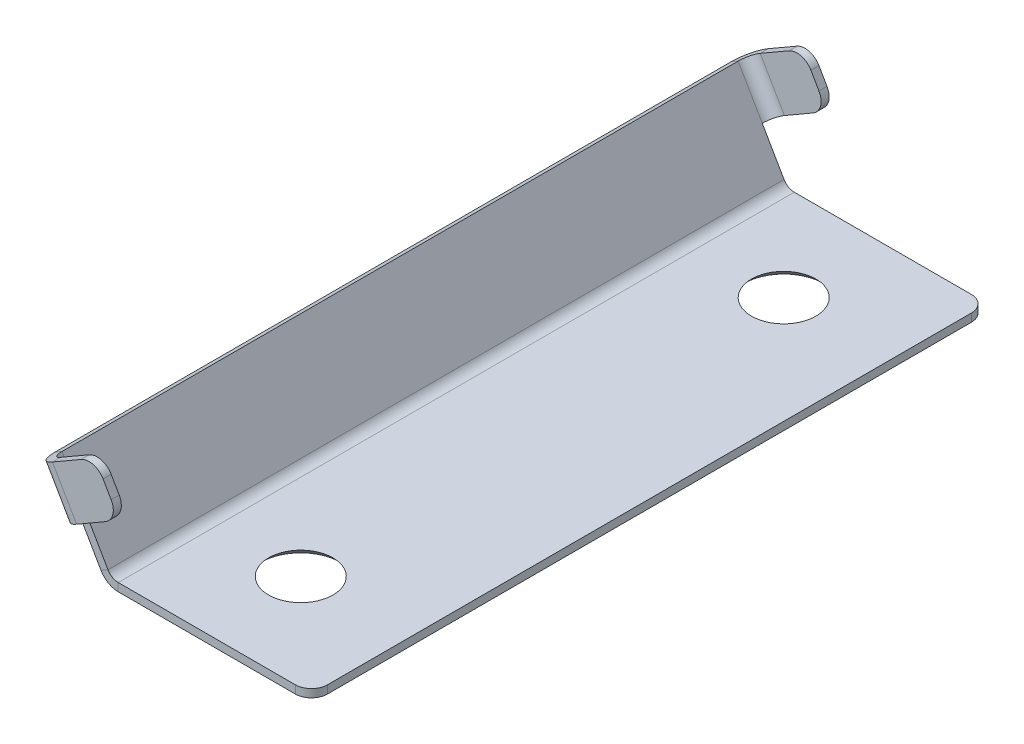
ISO-10303-21;
HEADER;
FILE_DESCRIPTION(('STEP AP214'),'2;1');
FILE_NAME('part.step','',(''),(''),'','','');
FILE_SCHEMA(('AUTOMOTIVE_DESIGN { 1 0 10303 214 1 1 1 1 }'));
ENDSEC;
DATA;
#1=APPLICATION_CONTEXT('core data for automotive mechanical design processes');
#2=APPLICATION_PROTOCOL_DEFINITION('international standard','automotive_design',2000,#1);
#3=PRODUCT_CONTEXT('',#1,'mechanical');
#4=PRODUCT('Part','Part','',(#3));
#5=PRODUCT_RELATED_PRODUCT_CATEGORY('part','',(#4));
#6=PRODUCT_DEFINITION_FORMATION('','',#4);
#7=PRODUCT_DEFINITION_CONTEXT('part definition',#1,'design');
#8=PRODUCT_DEFINITION('design','',#6,#7);
#9=PRODUCT_DEFINITION_SHAPE('','',#8);
#10=(LENGTH_UNIT() NAMED_UNIT(*) SI_UNIT(.MILLI.,.METRE.));
#11=(NAMED_UNIT(*) PLANE_ANGLE_UNIT() SI_UNIT($,.RADIAN.));
#12=(NAMED_UNIT(*) SI_UNIT($,.STERADIAN.) SOLID_ANGLE_UNIT());
#13=UNCERTAINTY_MEASURE_WITH_UNIT(LENGTH_MEASURE(1.E-05),#10,'distance_accuracy_value','');
#14=(GEOMETRIC_REPRESENTATION_CONTEXT(3) GLOBAL_UNCERTAINTY_ASSIGNED_CONTEXT((#13)) GLOBAL_UNIT_ASSIGNED_CONTEXT((#10,
#11,#12)) REPRESENTATION_CONTEXT('',''));
#15=CARTESIAN_POINT('',(0.,0.,0.));
#16=DIRECTION('',(0.,0.,1.));
#17=DIRECTION('',(1.,0.,0.));
#18=AXIS2_PLACEMENT_3D('',#15,#16,#17);
#19=CARTESIAN_POINT('',(3.50956793347722,-11.1454769923193,18.4625224714593));
#20=DIRECTION('',(0.86602540378444,0.499999999999998,0.));
#21=DIRECTION('',(0.,0.,1.));
#22=AXIS2_PLACEMENT_3D('',#19,#20,#21);
#23=PLANE('',#22);
#24=DIRECTION('',(0.499999999999998,-0.86602540378444,0.));
#25=VECTOR('',#24,1.);
#26=CARTESIAN_POINT('',(-4.49043206652275,2.71092946823175,18.4625224714593));
#27=LINE('',#26,#25);
#28=CARTESIAN_POINT('',(-4.49043206652275,2.71092946823175,18.4625224714593));
#29=VERTEX_POINT('',#28);
#30=CARTESIAN_POINT('',(-3.13791431242761,0.368300000000006,18.4625224714593));
#31=VERTEX_POINT('',#30);
#32=EDGE_CURVE('E235',#29,#31,#27,.T.);
#33=ORIENTED_EDGE('',*,*,#32,.T.);
#34=DIRECTION('',(0.,0.,-1.));
#35=VECTOR('',#34,1.);
#36=CARTESIAN_POINT('',(-3.13791431242761,0.368300000000004,18.4625224714593));
#37=LINE('',#36,#35);
#38=CARTESIAN_POINT('',(-3.13791431242761,0.368300000000002,-23.5374775285407));
#39=VERTEX_POINT('',#38);
#40=EDGE_CURVE('E222',#31,#39,#37,.T.);
#41=ORIENTED_EDGE('',*,*,#40,.T.);
#42=DIRECTION('',(-0.499999999999998,0.86602540378444,0.));
#43=VECTOR('',#42,1.);
#44=CARTESIAN_POINT('',(-4.49043206652276,2.71092946823175,-23.5374775285407));
#45=LINE('',#44,#43);
#46=CARTESIAN_POINT('',(-4.49043206652276,2.71092946823175,-23.5374775285407));
#47=VERTEX_POINT('',#46);
#48=EDGE_CURVE('E216',#39,#47,#45,.T.);
#49=ORIENTED_EDGE('',*,*,#48,.T.);
#50=DIRECTION('',(0.499999999999998,-0.86602540378444,0.));
#51=VECTOR('',#50,1.);
#52=CARTESIAN_POINT('',(3.50956793347724,-11.1454769923193,-23.5374775285406));
#53=LINE('',#52,#51);
#54=CARTESIAN_POINT('',(-5.99043206652275,5.30900567958507,-23.5374775285406));
#55=VERTEX_POINT('',#54);
#56=EDGE_CURVE('E382',#55,#47,#53,.T.);
#57=ORIENTED_EDGE('',*,*,#56,.F.);
#58=DIRECTION('',(0.,0.,1.));
#59=VECTOR('',#58,1.);
#60=CARTESIAN_POINT('',(-5.99043206652274,5.30900567958507,23.4625224714593));
#61=LINE('',#60,#59);
#62=CARTESIAN_POINT('',(-5.99043206652274,5.30900567958507,18.4625224714593));
#63=VERTEX_POINT('',#62);
#64=EDGE_CURVE('E386',#55,#63,#61,.T.);
#65=ORIENTED_EDGE('',*,*,#64,.T.);
#66=DIRECTION('',(0.499999999999998,-0.86602540378444,0.));
#67=VECTOR('',#66,1.);
#68=CARTESIAN_POINT('',(3.50956793347722,-11.1454769923193,18.4625224714593));
#69=LINE('',#68,#67);
#70=EDGE_CURVE('E373',#63,#29,#69,.T.);
#71=ORIENTED_EDGE('',*,*,#70,.T.);
#72=EDGE_LOOP('',(#33,#41,#49,#57,#65,#71));
#73=FACE_BOUND('',#72,.T.);
#74=ADVANCED_FACE('F48',(#73),#23,.T.);
#75=CARTESIAN_POINT('',(-4.92344476841497,2.46092946823175,18.4625224714593));
#76=DIRECTION('',(0.,0.,1.));
#77=DIRECTION('',(0.499999999999998,-0.86602540378444,0.));
#78=AXIS2_PLACEMENT_3D('',#75,#76,#77);
#79=PLANE('',#78);
#80=DIRECTION('',(0.499999999999998,-0.86602540378444,0.));
#81=VECTOR('',#80,1.);
#82=CARTESIAN_POINT('',(-4.92344476841497,2.46092946823175,18.4625224714593));
#83=LINE('',#82,#81);
#84=CARTESIAN_POINT('',(-4.92344476841497,2.46092946823175,18.4625224714593));
#85=VERTEX_POINT('',#84);
#86=CARTESIAN_POINT('',(-3.57092701431983,0.118300000000007,18.4625224714593));
#87=VERTEX_POINT('',#86);
#88=EDGE_CURVE('E371',#85,#87,#83,.T.);
#89=ORIENTED_EDGE('',*,*,#88,.T.);
#90=DIRECTION('',(0.86602540378444,0.499999999999998,0.));
#91=VECTOR('',#90,1.);
#92=CARTESIAN_POINT('',(-3.57092701431983,0.118300000000004,18.4625224714593));
#93=LINE('',#92,#91);
#94=EDGE_CURVE('E392',#87,#31,#93,.T.);
#95=ORIENTED_EDGE('',*,*,#94,.T.);
#96=ORIENTED_EDGE('',*,*,#32,.F.);
#97=DIRECTION('',(0.86602540378444,0.499999999999998,0.));
#98=VECTOR('',#97,1.);
#99=CARTESIAN_POINT('',(-4.92344476841497,2.46092946823175,18.4625224714593));
#100=LINE('',#99,#98);
#101=EDGE_CURVE('E370',#85,#29,#100,.T.);
#102=ORIENTED_EDGE('',*,*,#101,.F.);
#103=EDGE_LOOP('',(#89,#95,#96,#102));
#104=FACE_BOUND('',#103,.T.);
#105=ADVANCED_FACE('F464',(#104),#79,.T.);
#106=CARTESIAN_POINT('',(-4.92344476841498,2.46092946823175,-23.5374775285407));
#107=DIRECTION('',(0.,0.,-1.));
#108=DIRECTION('',(-0.499999999999998,0.86602540378444,0.));
#109=AXIS2_PLACEMENT_3D('',#106,#107,#108);
#110=PLANE('',#109);
#111=ORIENTED_EDGE('',*,*,#48,.F.);
#112=DIRECTION('',(-0.86602540378444,-0.499999999999998,0.));
#113=VECTOR('',#112,1.);
#114=CARTESIAN_POINT('',(-3.57092701431984,0.118300000000005,-23.5374775285407));
#115=LINE('',#114,#113);
#116=CARTESIAN_POINT('',(-3.57092701431984,0.1183,-23.5374775285406));
#117=VERTEX_POINT('',#116);
#118=EDGE_CURVE('E210',#39,#117,#115,.T.);
#119=ORIENTED_EDGE('',*,*,#118,.T.);
#120=DIRECTION('',(-0.499999999999998,0.86602540378444,0.));
#121=VECTOR('',#120,1.);
#122=CARTESIAN_POINT('',(-4.92344476841498,2.46092946823175,-23.5374775285407));
#123=LINE('',#122,#121);
#124=CARTESIAN_POINT('',(-4.92344476841498,2.46092946823175,-23.5374775285407));
#125=VERTEX_POINT('',#124);
#126=EDGE_CURVE('E214',#117,#125,#123,.T.);
#127=ORIENTED_EDGE('',*,*,#126,.T.);
#128=DIRECTION('',(0.86602540378444,0.499999999999998,0.));
#129=VECTOR('',#128,1.);
#130=CARTESIAN_POINT('',(-4.92344476841498,2.46092946823175,-23.5374775285407));
#131=LINE('',#130,#129);
#132=EDGE_CURVE('E245',#125,#47,#131,.T.);
#133=ORIENTED_EDGE('',*,*,#132,.T.);
#134=EDGE_LOOP('',(#111,#119,#127,#133));
#135=FACE_BOUND('',#134,.T.);
#136=ADVANCED_FACE('F212',(#135),#110,.T.);
#137=CARTESIAN_POINT('',(3.076555231585,-11.3954769923193,18.4625224714593));
#138=DIRECTION('',(0.86602540378444,0.499999999999998,0.));
#139=DIRECTION('',(0.,0.,1.));
#140=AXIS2_PLACEMENT_3D('',#137,#138,#139);
#141=PLANE('',#140);
#142=DIRECTION('',(0.,0.,-1.));
#143=VECTOR('',#142,1.);
#144=CARTESIAN_POINT('',(-3.57092701431983,0.118300000000004,18.4625224714593));
#145=LINE('',#144,#143);
#146=EDGE_CURVE('E223',#87,#117,#145,.T.);
#147=ORIENTED_EDGE('',*,*,#146,.F.);
#148=ORIENTED_EDGE('',*,*,#88,.F.);
#149=DIRECTION('',(0.499999999999998,-0.86602540378444,0.));
#150=VECTOR('',#149,1.);
#151=CARTESIAN_POINT('',(3.076555231585,-11.3954769923193,18.4625224714593));
#152=LINE('',#151,#150);
#153=CARTESIAN_POINT('',(-6.42344476841497,5.05900567958507,18.4625224714593));
#154=VERTEX_POINT('',#153);
#155=EDGE_CURVE('E368',#154,#85,#152,.T.);
#156=ORIENTED_EDGE('',*,*,#155,.F.);
#157=DIRECTION('',(0.,0.,1.));
#158=VECTOR('',#157,1.);
#159=CARTESIAN_POINT('',(-6.42344476841496,5.05900567958507,23.4625224714593));
#160=LINE('',#159,#158);
#161=CARTESIAN_POINT('',(-6.42344476841497,5.05900567958507,-23.5374775285406));
#162=VERTEX_POINT('',#161);
#163=EDGE_CURVE('E234',#162,#154,#160,.T.);
#164=ORIENTED_EDGE('',*,*,#163,.F.);
#165=DIRECTION('',(0.499999999999998,-0.86602540378444,0.));
#166=VECTOR('',#165,1.);
#167=CARTESIAN_POINT('',(3.07655523158502,-11.3954769923193,-23.5374775285406));
#168=LINE('',#167,#166);
#169=EDGE_CURVE('E233',#162,#125,#168,.T.);
#170=ORIENTED_EDGE('',*,*,#169,.T.);
#171=ORIENTED_EDGE('',*,*,#126,.F.);
#172=EDGE_LOOP('',(#147,#148,#156,#164,#170,#171));
#173=FACE_BOUND('',#172,.T.);
#174=ADVANCED_FACE('F228',(#173),#141,.F.);
#175=CARTESIAN_POINT('',(-6.42344476841496,5.05900567958507,23.4625224714593));
#176=DIRECTION('',(-0.499999999999998,0.86602540378444,0.));
#177=DIRECTION('',(0.,0.,1.));
#178=AXIS2_PLACEMENT_3D('',#175,#176,#177);
#179=PLANE('',#178);
#180=DIRECTION('',(0.86602540378444,0.499999999999998,0.));
#181=VECTOR('',#180,1.);
#182=CARTESIAN_POINT('',(-6.42344476841497,5.05900567958507,-23.5374775285406));
#183=LINE('',#182,#181);
#184=EDGE_CURVE('E380',#162,#55,#183,.T.);
#185=ORIENTED_EDGE('',*,*,#184,.F.);
#186=ORIENTED_EDGE('',*,*,#163,.T.);
#187=DIRECTION('',(0.86602540378444,0.499999999999998,0.));
#188=VECTOR('',#187,1.);
#189=CARTESIAN_POINT('',(-6.42344476841496,5.05900567958507,18.4625224714593));
#190=LINE('',#189,#188);
#191=EDGE_CURVE('E376',#154,#63,#190,.T.);
#192=ORIENTED_EDGE('',*,*,#191,.T.);
#193=ORIENTED_EDGE('',*,*,#64,.F.);
#194=EDGE_LOOP('',(#185,#186,#192,#193));
#195=FACE_BOUND('',#194,.T.);
#196=ADVANCED_FACE('F625',(#195),#179,.T.);
#197=CARTESIAN_POINT('',(-5.35251775409513,5.67730567958506,18.4625224714593));
#198=DIRECTION('',(-0.499999999999998,0.86602540378444,0.));
#199=DIRECTION('',(0.,0.,1.));
#200=AXIS2_PLACEMENT_3D('',#197,#198,#199);
#201=PLANE('',#200);
#202=DIRECTION('',(0.,0.,-1.));
#203=VECTOR('',#202,1.);
#204=CARTESIAN_POINT('',(-5.35251775409512,5.67730567958507,19.6991224714593));
#205=LINE('',#204,#203);
#206=CARTESIAN_POINT('',(-5.35251775409512,5.67730567958507,19.6991224714593));
#207=VERTEX_POINT('',#206);
#208=CARTESIAN_POINT('',(-5.35251775409512,5.67730567958507,19.1991224714593));
#209=VERTEX_POINT('',#208);
#210=EDGE_CURVE('E325',#207,#209,#205,.T.);
#211=ORIENTED_EDGE('',*,*,#210,.T.);
#212=CARTESIAN_POINT('',(-5.35251775409513,5.67730567958507,18.4625224714593));
#213=DIRECTION('',(-0.499999999999998,0.86602540378444,0.));
#214=DIRECTION('',(0.,0.,1.));
#215=AXIS2_PLACEMENT_3D('',#212,#213,#214);
#216=CIRCLE('',#215,0.7366);
#217=EDGE_CURVE('E333',#209,#63,#216,.F.);
#218=ORIENTED_EDGE('',*,*,#217,.T.);
#219=ORIENTED_EDGE('',*,*,#191,.F.);
#220=CARTESIAN_POINT('',(-5.35251775409513,5.67730567958506,18.4625224714593));
#221=DIRECTION('',(0.499999999999998,-0.86602540378444,0.));
#222=DIRECTION('',(0.,0.,1.));
#223=AXIS2_PLACEMENT_3D('',#220,#221,#222);
#224=CIRCLE('',#223,1.2366);
#225=EDGE_CURVE('E358',#207,#154,#224,.T.);
#226=ORIENTED_EDGE('',*,*,#225,.F.);
#227=EDGE_LOOP('',(#211,#218,#219,#226));
#228=FACE_BOUND('',#227,.T.);
#229=ADVANCED_FACE('F622',(#228),#201,.T.);
#230=CARTESIAN_POINT('',(-3.85251775409513,3.07922946823175,18.4625224714593));
#231=DIRECTION('',(0.499999999999998,-0.86602540378444,0.));
#232=DIRECTION('',(0.,0.,-1.));
#233=AXIS2_PLACEMENT_3D('',#230,#231,#232);
#234=PLANE('',#233);
#235=CARTESIAN_POINT('',(-3.85251775409513,3.07922946823175,18.4625224714593));
#236=DIRECTION('',(-0.499999999999998,0.86602540378444,0.));
#237=DIRECTION('',(0.,0.,1.));
#238=AXIS2_PLACEMENT_3D('',#235,#236,#237);
#239=CIRCLE('',#238,0.7366);
#240=CARTESIAN_POINT('',(-3.85251775409513,3.07922946823175,19.1991224714593));
#241=VERTEX_POINT('',#240);
#242=EDGE_CURVE('E362',#29,#241,#239,.T.);
#243=ORIENTED_EDGE('',*,*,#242,.T.);
#244=DIRECTION('',(0.,0.,1.));
#245=VECTOR('',#244,1.);
#246=CARTESIAN_POINT('',(-3.85251775409513,3.07922946823175,19.6991224714593));
#247=LINE('',#246,#245);
#248=CARTESIAN_POINT('',(-3.85251775409513,3.07922946823175,19.6991224714593));
#249=VERTEX_POINT('',#248);
#250=EDGE_CURVE('E350',#241,#249,#247,.T.);
#251=ORIENTED_EDGE('',*,*,#250,.T.);
#252=CARTESIAN_POINT('',(-3.85251775409513,3.07922946823175,18.4625224714593));
#253=DIRECTION('',(-0.499999999999998,0.86602540378444,0.));
#254=DIRECTION('',(0.,0.,-1.));
#255=AXIS2_PLACEMENT_3D('',#252,#253,#254);
#256=CIRCLE('',#255,1.2366);
#257=EDGE_CURVE('E361',#85,#249,#256,.T.);
#258=ORIENTED_EDGE('',*,*,#257,.F.);
#259=ORIENTED_EDGE('',*,*,#101,.T.);
#260=EDGE_LOOP('',(#243,#251,#258,#259));
#261=FACE_BOUND('',#260,.T.);
#262=ADVANCED_FACE('F617',(#261),#234,.T.);
#263=CARTESIAN_POINT('',(-2.79814117693213,1.25299566627484,18.4625224714593));
#264=DIRECTION('',(-0.499999999999998,0.86602540378444,0.));
#265=DIRECTION('',(0.,0.,1.));
#266=AXIS2_PLACEMENT_3D('',#263,#264,#265);
#267=CYLINDRICAL_SURFACE('',#266,1.2366);
#268=ORIENTED_EDGE('',*,*,#155,.T.);
#269=ORIENTED_EDGE('',*,*,#257,.T.);
#270=DIRECTION('',(0.499999999999998,-0.86602540378444,0.));
#271=VECTOR('',#270,1.);
#272=CARTESIAN_POINT('',(4.14748224590484,-10.7771769923193,19.6991224714593));
#273=LINE('',#272,#271);
#274=EDGE_CURVE('E344',#207,#249,#273,.T.);
#275=ORIENTED_EDGE('',*,*,#274,.F.);
#276=ORIENTED_EDGE('',*,*,#225,.T.);
#277=EDGE_LOOP('',(#268,#269,#275,#276));
#278=FACE_BOUND('',#277,.T.);
#279=ADVANCED_FACE('F614',(#278),#267,.T.);
#280=CARTESIAN_POINT('',(-2.79814117693213,1.25299566627484,18.4625224714593));
#281=DIRECTION('',(-0.499999999999998,0.86602540378444,0.));
#282=DIRECTION('',(0.,0.,1.));
#283=AXIS2_PLACEMENT_3D('',#280,#281,#282);
#284=CYLINDRICAL_SURFACE('',#283,0.7366);
#285=ORIENTED_EDGE('',*,*,#70,.F.);
#286=ORIENTED_EDGE('',*,*,#217,.F.);
#287=DIRECTION('',(0.499999999999998,-0.86602540378444,0.));
#288=VECTOR('',#287,1.);
#289=CARTESIAN_POINT('',(4.14748224590484,-10.7771769923193,19.1991224714593));
#290=LINE('',#289,#288);
#291=EDGE_CURVE('E353',#209,#241,#290,.T.);
#292=ORIENTED_EDGE('',*,*,#291,.T.);
#293=ORIENTED_EDGE('',*,*,#242,.F.);
#294=EDGE_LOOP('',(#285,#286,#292,#293));
#295=FACE_BOUND('',#294,.T.);
#296=ADVANCED_FACE('F598',(#295),#284,.F.);
#297=CARTESIAN_POINT('',(-2.70459895553195,7.20608231072777,19.6991224714593));
#298=DIRECTION('',(0.866025403784439,0.499999999999999,0.));
#299=DIRECTION('',(0.499999999999999,-0.866025403784439,0.));
#300=AXIS2_PLACEMENT_3D('',#297,#298,#299);
#301=PLANE('',#300);
#302=DIRECTION('',(0.499999999999999,-0.866025403784439,0.));
#303=VECTOR('',#302,1.);
#304=CARTESIAN_POINT('',(-2.70459895553195,7.20608231072777,19.6991224714593));
#305=LINE('',#304,#303);
#306=CARTESIAN_POINT('',(-2.20459895553196,6.34005690694334,19.6991224714593));
#307=VERTEX_POINT('',#306);
#308=CARTESIAN_POINT('',(-1.70459895553196,5.4740315031589,19.6991224714593));
#309=VERTEX_POINT('',#308);
#310=EDGE_CURVE('E347',#307,#309,#305,.T.);
#311=ORIENTED_EDGE('',*,*,#310,.T.);
#312=DIRECTION('',(0.,0.,-1.));
#313=VECTOR('',#312,1.);
#314=CARTESIAN_POINT('',(-1.70459895553196,5.4740315031589,19.6991224714593));
#315=LINE('',#314,#313);
#316=CARTESIAN_POINT('',(-1.70459895553196,5.4740315031589,19.1991224714593));
#317=VERTEX_POINT('',#316);
#318=EDGE_CURVE('E418',#309,#317,#315,.T.);
#319=ORIENTED_EDGE('',*,*,#318,.T.);
#320=DIRECTION('',(0.499999999999999,-0.866025403784439,0.));
#321=VECTOR('',#320,1.);
#322=CARTESIAN_POINT('',(-2.70459895553196,7.20608231072777,19.1991224714593));
#323=LINE('',#322,#321);
#324=CARTESIAN_POINT('',(-2.20459895553196,6.34005690694333,19.1991224714593));
#325=VERTEX_POINT('',#324);
#326=EDGE_CURVE('E336',#325,#317,#323,.T.);
#327=ORIENTED_EDGE('',*,*,#326,.F.);
#328=DIRECTION('',(0.,0.,-1.));
#329=VECTOR('',#328,1.);
#330=CARTESIAN_POINT('',(-2.20459895553196,6.34005690694334,19.6991224714593));
#331=LINE('',#330,#329);
#332=EDGE_CURVE('E416',#325,#307,#331,.F.);
#333=ORIENTED_EDGE('',*,*,#332,.T.);
#334=EDGE_LOOP('',(#311,#319,#327,#333));
#335=FACE_BOUND('',#334,.T.);
#336=ADVANCED_FACE('F594',(#335),#301,.T.);
#337=CARTESIAN_POINT('',(2.46527402554583,-11.7484003611766,19.6991224714593));
#338=DIRECTION('',(0.,0.,-1.));
#339=DIRECTION('',(0.866025403784439,0.499999999999999,0.));
#340=AXIS2_PLACEMENT_3D('',#337,#338,#339);
#341=PLANE('',#340);
#342=DIRECTION('',(-0.866025403784439,-0.499999999999999,0.));
#343=VECTOR('',#342,1.);
#344=CARTESIAN_POINT('',(-5.53472597445416,2.10800609937446,19.6991224714593));
#345=LINE('',#344,#343);
#346=CARTESIAN_POINT('',(-2.0706243593164,4.10800609937446,19.6991224714593));
#347=VERTEX_POINT('',#346);
#348=EDGE_CURVE('E342',#347,#249,#345,.T.);
#349=ORIENTED_EDGE('',*,*,#348,.F.);
#350=CARTESIAN_POINT('',(-2.5706243593164,4.9740315031589,19.6991224714593));
#351=DIRECTION('',(0.,0.,-1.));
#352=DIRECTION('',(-1.,0.,0.));
#353=AXIS2_PLACEMENT_3D('',#350,#351,#352);
#354=CIRCLE('',#353,1.);
#355=EDGE_CURVE('E429',#347,#309,#354,.F.);
#356=ORIENTED_EDGE('',*,*,#355,.T.);
#357=ORIENTED_EDGE('',*,*,#310,.F.);
#358=CARTESIAN_POINT('',(-3.07062435931639,5.84005690694334,19.6991224714593));
#359=DIRECTION('',(0.,0.,-1.));
#360=DIRECTION('',(-1.,0.,0.));
#361=AXIS2_PLACEMENT_3D('',#358,#359,#360);
#362=CIRCLE('',#361,1.);
#363=CARTESIAN_POINT('',(-3.57062435931639,6.70608231072778,19.6991224714593));
#364=VERTEX_POINT('',#363);
#365=EDGE_CURVE('E427',#307,#364,#362,.F.);
#366=ORIENTED_EDGE('',*,*,#365,.T.);
#367=DIRECTION('',(0.866025403784439,0.499999999999999,0.));
#368=VECTOR('',#367,1.);
#369=CARTESIAN_POINT('',(-2.70459895553195,7.20608231072777,19.6991224714593));
#370=LINE('',#369,#368);
#371=EDGE_CURVE('E330',#207,#364,#370,.T.);
#372=ORIENTED_EDGE('',*,*,#371,.F.);
#373=ORIENTED_EDGE('',*,*,#274,.T.);
#374=EDGE_LOOP('',(#349,#356,#357,#366,#372,#373));
#375=FACE_BOUND('',#374,.T.);
#376=ADVANCED_FACE('F597',(#375),#341,.F.);
#377=CARTESIAN_POINT('',(-5.53472597445416,2.10800609937446,19.6991224714593));
#378=DIRECTION('',(0.499999999999999,-0.866025403784439,0.));
#379=DIRECTION('',(-0.866025403784439,-0.499999999999999,0.));
#380=AXIS2_PLACEMENT_3D('',#377,#378,#379);
#381=PLANE('',#380);
#382=DIRECTION('',(-0.866025403784439,-0.499999999999999,0.));
#383=VECTOR('',#382,1.);
#384=CARTESIAN_POINT('',(-5.53472597445416,2.10800609937446,19.1991224714594));
#385=LINE('',#384,#383);
#386=CARTESIAN_POINT('',(-2.0706243593164,4.10800609937446,19.1991224714593));
#387=VERTEX_POINT('',#386);
#388=EDGE_CURVE('E334',#387,#241,#385,.T.);
#389=ORIENTED_EDGE('',*,*,#388,.F.);
#390=DIRECTION('',(0.,0.,-1.));
#391=VECTOR('',#390,1.);
#392=CARTESIAN_POINT('',(-2.0706243593164,4.10800609937446,19.6991224714593));
#393=LINE('',#392,#391);
#394=EDGE_CURVE('E425',#387,#347,#393,.F.);
#395=ORIENTED_EDGE('',*,*,#394,.T.);
#396=ORIENTED_EDGE('',*,*,#348,.T.);
#397=ORIENTED_EDGE('',*,*,#250,.F.);
#398=EDGE_LOOP('',(#389,#395,#396,#397));
#399=FACE_BOUND('',#398,.T.);
#400=ADVANCED_FACE('F602',(#399),#381,.T.);
#401=CARTESIAN_POINT('',(2.46527402554582,-11.7484003611766,19.1991224714593));
#402=DIRECTION('',(0.,0.,-1.));
#403=DIRECTION('',(0.866025403784439,0.499999999999999,0.));
#404=AXIS2_PLACEMENT_3D('',#401,#402,#403);
#405=PLANE('',#404);
#406=ORIENTED_EDGE('',*,*,#326,.T.);
#407=CARTESIAN_POINT('',(-2.5706243593164,4.9740315031589,19.1991224714593));
#408=DIRECTION('',(0.,0.,-1.));
#409=DIRECTION('',(-1.,0.,0.));
#410=AXIS2_PLACEMENT_3D('',#407,#408,#409);
#411=CIRCLE('',#410,1.);
#412=EDGE_CURVE('E423',#317,#387,#411,.T.);
#413=ORIENTED_EDGE('',*,*,#412,.T.);
#414=ORIENTED_EDGE('',*,*,#388,.T.);
#415=ORIENTED_EDGE('',*,*,#291,.F.);
#416=DIRECTION('',(0.866025403784439,0.499999999999999,0.));
#417=VECTOR('',#416,1.);
#418=CARTESIAN_POINT('',(-2.70459895553196,7.20608231072777,19.1991224714593));
#419=LINE('',#418,#417);
#420=CARTESIAN_POINT('',(-3.5706243593164,6.70608231072778,19.1991224714593));
#421=VERTEX_POINT('',#420);
#422=EDGE_CURVE('E339',#209,#421,#419,.T.);
#423=ORIENTED_EDGE('',*,*,#422,.T.);
#424=CARTESIAN_POINT('',(-3.0706243593164,5.84005690694334,19.1991224714593));
#425=DIRECTION('',(0.,0.,-1.));
#426=DIRECTION('',(-1.,0.,0.));
#427=AXIS2_PLACEMENT_3D('',#424,#425,#426);
#428=CIRCLE('',#427,1.);
#429=EDGE_CURVE('E421',#421,#325,#428,.T.);
#430=ORIENTED_EDGE('',*,*,#429,.T.);
#431=EDGE_LOOP('',(#406,#413,#414,#415,#423,#430));
#432=FACE_BOUND('',#431,.T.);
#433=ADVANCED_FACE('F606',(#432),#405,.T.);
#434=CARTESIAN_POINT('',(-2.70459895553195,7.20608231072777,19.6991224714593));
#435=DIRECTION('',(-0.499999999999999,0.866025403784439,0.));
#436=DIRECTION('',(0.866025403784439,0.499999999999999,0.));
#437=AXIS2_PLACEMENT_3D('',#434,#435,#436);
#438=PLANE('',#437);
#439=ORIENTED_EDGE('',*,*,#371,.T.);
#440=DIRECTION('',(0.,0.,-1.));
#441=VECTOR('',#440,1.);
#442=CARTESIAN_POINT('',(-3.57062435931639,6.70608231072778,19.6991224714593));
#443=LINE('',#442,#441);
#444=EDGE_CURVE('E431',#364,#421,#443,.T.);
#445=ORIENTED_EDGE('',*,*,#444,.T.);
#446=ORIENTED_EDGE('',*,*,#422,.F.);
#447=ORIENTED_EDGE('',*,*,#210,.F.);
#448=EDGE_LOOP('',(#439,#445,#446,#447));
#449=FACE_BOUND('',#448,.T.);
#450=ADVANCED_FACE('F592',(#449),#438,.T.);
#451=CARTESIAN_POINT('',(-5.35251775409513,5.67730567958507,-23.5374775285407));
#452=DIRECTION('',(-0.499999999999998,0.86602540378444,0.));
#453=DIRECTION('',(0.,0.,1.));
#454=AXIS2_PLACEMENT_3D('',#451,#452,#453);
#455=PLANE('',#454);
#456=ORIENTED_EDGE('',*,*,#184,.T.);
#457=CARTESIAN_POINT('',(-5.35251775409513,5.67730567958507,-23.5374775285406));
#458=DIRECTION('',(0.499999999999998,-0.86602540378444,0.));
#459=DIRECTION('',(0.,0.,-1.));
#460=AXIS2_PLACEMENT_3D('',#457,#458,#459);
#461=CIRCLE('',#460,0.7366);
#462=CARTESIAN_POINT('',(-5.35251775409514,5.67730567958506,-24.2740775285407));
#463=VERTEX_POINT('',#462);
#464=EDGE_CURVE('E295',#55,#463,#461,.T.);
#465=ORIENTED_EDGE('',*,*,#464,.T.);
#466=DIRECTION('',(0.,0.,1.));
#467=VECTOR('',#466,1.);
#468=CARTESIAN_POINT('',(-5.35251775409513,5.67730567958507,-24.7740775285407));
#469=LINE('',#468,#467);
#470=CARTESIAN_POINT('',(-5.35251775409514,5.67730567958506,-24.7740775285407));
#471=VERTEX_POINT('',#470);
#472=EDGE_CURVE('E309',#471,#463,#469,.T.);
#473=ORIENTED_EDGE('',*,*,#472,.F.);
#474=CARTESIAN_POINT('',(-5.35251775409513,5.67730567958507,-23.5374775285407));
#475=DIRECTION('',(0.499999999999998,-0.86602540378444,0.));
#476=DIRECTION('',(0.,0.,1.));
#477=AXIS2_PLACEMENT_3D('',#474,#475,#476);
#478=CIRCLE('',#477,1.2366);
#479=EDGE_CURVE('E318',#162,#471,#478,.T.);
#480=ORIENTED_EDGE('',*,*,#479,.F.);
#481=EDGE_LOOP('',(#456,#465,#473,#480));
#482=FACE_BOUND('',#481,.T.);
#483=ADVANCED_FACE('F589',(#482),#455,.T.);
#484=CARTESIAN_POINT('',(-3.85251775409514,3.07922946823175,-23.5374775285406));
#485=DIRECTION('',(0.499999999999998,-0.86602540378444,0.));
#486=DIRECTION('',(0.,0.,-1.));
#487=AXIS2_PLACEMENT_3D('',#484,#485,#486);
#488=PLANE('',#487);
#489=DIRECTION('',(0.,0.,-1.));
#490=VECTOR('',#489,1.);
#491=CARTESIAN_POINT('',(-3.85251775409513,3.07922946823175,-24.7740775285407));
#492=LINE('',#491,#490);
#493=CARTESIAN_POINT('',(-3.85251775409514,3.07922946823175,-24.2740775285407));
#494=VERTEX_POINT('',#493);
#495=CARTESIAN_POINT('',(-3.85251775409514,3.07922946823175,-24.7740775285406));
#496=VERTEX_POINT('',#495);
#497=EDGE_CURVE('E296',#494,#496,#492,.T.);
#498=ORIENTED_EDGE('',*,*,#497,.F.);
#499=CARTESIAN_POINT('',(-3.85251775409514,3.07922946823175,-23.5374775285406));
#500=DIRECTION('',(0.499999999999998,-0.86602540378444,0.));
#501=DIRECTION('',(0.,0.,-1.));
#502=AXIS2_PLACEMENT_3D('',#499,#500,#501);
#503=CIRCLE('',#502,0.7366);
#504=EDGE_CURVE('E322',#494,#47,#503,.F.);
#505=ORIENTED_EDGE('',*,*,#504,.T.);
#506=ORIENTED_EDGE('',*,*,#132,.F.);
#507=CARTESIAN_POINT('',(-3.85251775409514,3.07922946823175,-23.5374775285406));
#508=DIRECTION('',(-0.499999999999998,0.86602540378444,0.));
#509=DIRECTION('',(0.,0.,-1.));
#510=AXIS2_PLACEMENT_3D('',#507,#508,#509);
#511=CIRCLE('',#510,1.2366);
#512=EDGE_CURVE('E321',#496,#125,#511,.T.);
#513=ORIENTED_EDGE('',*,*,#512,.F.);
#514=EDGE_LOOP('',(#498,#505,#506,#513));
#515=FACE_BOUND('',#514,.T.);
#516=ADVANCED_FACE('F520',(#515),#488,.T.);
#517=CARTESIAN_POINT('',(-6.40689433125814,7.50353948154198,-23.5374775285407));
#518=DIRECTION('',(0.499999999999998,-0.86602540378444,0.));
#519=DIRECTION('',(0.,0.,-1.));
#520=AXIS2_PLACEMENT_3D('',#517,#518,#519);
#521=CYLINDRICAL_SURFACE('',#520,1.2366);
#522=ORIENTED_EDGE('',*,*,#512,.T.);
#523=ORIENTED_EDGE('',*,*,#169,.F.);
#524=ORIENTED_EDGE('',*,*,#479,.T.);
#525=DIRECTION('',(0.499999999999998,-0.86602540378444,0.));
#526=VECTOR('',#525,1.);
#527=CARTESIAN_POINT('',(4.14748224590486,-10.7771769923193,-24.7740775285406));
#528=LINE('',#527,#526);
#529=EDGE_CURVE('E266',#471,#496,#528,.T.);
#530=ORIENTED_EDGE('',*,*,#529,.T.);
#531=EDGE_LOOP('',(#522,#523,#524,#530));
#532=FACE_BOUND('',#531,.T.);
#533=ADVANCED_FACE('F518',(#532),#521,.T.);
#534=CARTESIAN_POINT('',(-6.40689433125814,7.50353948154198,-23.5374775285407));
#535=DIRECTION('',(0.499999999999998,-0.86602540378444,0.));
#536=DIRECTION('',(0.,0.,-1.));
#537=AXIS2_PLACEMENT_3D('',#534,#535,#536);
#538=CYLINDRICAL_SURFACE('',#537,0.7366);
#539=ORIENTED_EDGE('',*,*,#504,.F.);
#540=DIRECTION('',(0.499999999999998,-0.86602540378444,0.));
#541=VECTOR('',#540,1.);
#542=CARTESIAN_POINT('',(4.14748224590486,-10.7771769923193,-24.2740775285406));
#543=LINE('',#542,#541);
#544=EDGE_CURVE('E304',#463,#494,#543,.T.);
#545=ORIENTED_EDGE('',*,*,#544,.F.);
#546=ORIENTED_EDGE('',*,*,#464,.F.);
#547=ORIENTED_EDGE('',*,*,#56,.T.);
#548=EDGE_LOOP('',(#539,#545,#546,#547));
#549=FACE_BOUND('',#548,.T.);
#550=ADVANCED_FACE('F524',(#549),#538,.F.);
#551=CARTESIAN_POINT('',(-2.70459895553196,7.20608231072778,-24.7740775285406));
#552=DIRECTION('',(0.866025403784439,0.499999999999999,0.));
#553=DIRECTION('',(-0.499999999999999,0.866025403784439,0.));
#554=AXIS2_PLACEMENT_3D('',#551,#552,#553);
#555=PLANE('',#554);
#556=DIRECTION('',(-0.499999999999999,0.866025403784439,0.));
#557=VECTOR('',#556,1.);
#558=CARTESIAN_POINT('',(-2.70459895553196,7.20608231072778,-24.2740775285406));
#559=LINE('',#558,#557);
#560=CARTESIAN_POINT('',(-1.70459895553196,5.4740315031589,-24.2740775285406));
#561=VERTEX_POINT('',#560);
#562=CARTESIAN_POINT('',(-2.20459895553196,6.34005690694334,-24.2740775285406));
#563=VERTEX_POINT('',#562);
#564=EDGE_CURVE('E298',#561,#563,#559,.T.);
#565=ORIENTED_EDGE('',*,*,#564,.F.);
#566=DIRECTION('',(0.,0.,1.));
#567=VECTOR('',#566,1.);
#568=CARTESIAN_POINT('',(-1.70459895553196,5.4740315031589,-24.7740775285406));
#569=LINE('',#568,#567);
#570=CARTESIAN_POINT('',(-1.70459895553196,5.4740315031589,-24.7740775285406));
#571=VERTEX_POINT('',#570);
#572=EDGE_CURVE('E444',#561,#571,#569,.F.);
#573=ORIENTED_EDGE('',*,*,#572,.T.);
#574=DIRECTION('',(-0.499999999999999,0.866025403784439,0.));
#575=VECTOR('',#574,1.);
#576=CARTESIAN_POINT('',(-2.70459895553196,7.20608231072778,-24.7740775285406));
#577=LINE('',#576,#575);
#578=CARTESIAN_POINT('',(-2.20459895553196,6.34005690694334,-24.7740775285406));
#579=VERTEX_POINT('',#578);
#580=EDGE_CURVE('E314',#571,#579,#577,.T.);
#581=ORIENTED_EDGE('',*,*,#580,.T.);
#582=DIRECTION('',(0.,0.,1.));
#583=VECTOR('',#582,1.);
#584=CARTESIAN_POINT('',(-2.20459895553196,6.34005690694334,-24.7740775285406));
#585=LINE('',#584,#583);
#586=EDGE_CURVE('E441',#579,#563,#585,.T.);
#587=ORIENTED_EDGE('',*,*,#586,.T.);
#588=EDGE_LOOP('',(#565,#573,#581,#587));
#589=FACE_BOUND('',#588,.T.);
#590=ADVANCED_FACE('F503',(#589),#555,.T.);
#591=CARTESIAN_POINT('',(-33.9077929334006,-32.7484003611765,-24.7740775285408));
#592=DIRECTION('',(0.,0.,1.));
#593=DIRECTION('',(-0.866025403784439,-0.499999999999999,0.));
#594=AXIS2_PLACEMENT_3D('',#591,#592,#593);
#595=PLANE('',#594);
#596=ORIENTED_EDGE('',*,*,#580,.F.);
#597=CARTESIAN_POINT('',(-2.5706243593164,4.9740315031589,-24.7740775285407));
#598=DIRECTION('',(0.,0.,1.));
#599=DIRECTION('',(1.,0.,0.));
#600=AXIS2_PLACEMENT_3D('',#597,#598,#599);
#601=CIRCLE('',#600,1.);
#602=CARTESIAN_POINT('',(-2.0706243593164,4.10800609937446,-24.7740775285406));
#603=VERTEX_POINT('',#602);
#604=EDGE_CURVE('E447',#571,#603,#601,.F.);
#605=ORIENTED_EDGE('',*,*,#604,.T.);
#606=DIRECTION('',(0.866025403784439,0.499999999999999,0.));
#607=VECTOR('',#606,1.);
#608=CARTESIAN_POINT('',(-5.53472597445416,2.10800609937447,-24.7740775285407));
#609=LINE('',#608,#607);
#610=EDGE_CURVE('E292',#496,#603,#609,.T.);
#611=ORIENTED_EDGE('',*,*,#610,.F.);
#612=ORIENTED_EDGE('',*,*,#529,.F.);
#613=DIRECTION('',(-0.866025403784439,-0.499999999999999,0.));
#614=VECTOR('',#613,1.);
#615=CARTESIAN_POINT('',(-47.7379199523228,-18.7939176892722,-24.7740775285408));
#616=LINE('',#615,#614);
#617=CARTESIAN_POINT('',(-3.5706243593164,6.70608231072778,-24.7740775285407));
#618=VERTEX_POINT('',#617);
#619=EDGE_CURVE('E312',#618,#471,#616,.T.);
#620=ORIENTED_EDGE('',*,*,#619,.F.);
#621=CARTESIAN_POINT('',(-3.0706243593164,5.84005690694335,-24.7740775285407));
#622=DIRECTION('',(0.,0.,1.));
#623=DIRECTION('',(1.,0.,0.));
#624=AXIS2_PLACEMENT_3D('',#621,#622,#623);
#625=CIRCLE('',#624,1.);
#626=EDGE_CURVE('E70',#618,#579,#625,.F.);
#627=ORIENTED_EDGE('',*,*,#626,.T.);
#628=EDGE_LOOP('',(#596,#605,#611,#612,#620,#627));
#629=FACE_BOUND('',#628,.T.);
#630=ADVANCED_FACE('F514',(#629),#595,.F.);
#631=CARTESIAN_POINT('',(-47.7379199523228,-18.7939176892722,-24.7740775285408));
#632=DIRECTION('',(-0.499999999999999,0.866025403784439,0.));
#633=DIRECTION('',(-0.866025403784439,-0.499999999999999,0.));
#634=AXIS2_PLACEMENT_3D('',#631,#632,#633);
#635=PLANE('',#634);
#636=DIRECTION('',(-0.866025403784439,-0.499999999999999,0.));
#637=VECTOR('',#636,1.);
#638=CARTESIAN_POINT('',(-47.7379199523228,-18.7939176892722,-24.2740775285408));
#639=LINE('',#638,#637);
#640=CARTESIAN_POINT('',(-3.57062435931641,6.70608231072778,-24.2740775285407));
#641=VERTEX_POINT('',#640);
#642=EDGE_CURVE('E307',#641,#463,#639,.T.);
#643=ORIENTED_EDGE('',*,*,#642,.F.);
#644=DIRECTION('',(0.,0.,1.));
#645=VECTOR('',#644,1.);
#646=CARTESIAN_POINT('',(-3.5706243593164,6.70608231072778,-24.7740775285407));
#647=LINE('',#646,#645);
#648=EDGE_CURVE('E63',#641,#618,#647,.F.);
#649=ORIENTED_EDGE('',*,*,#648,.T.);
#650=ORIENTED_EDGE('',*,*,#619,.T.);
#651=ORIENTED_EDGE('',*,*,#472,.T.);
#652=EDGE_LOOP('',(#643,#649,#650,#651));
#653=FACE_BOUND('',#652,.T.);
#654=ADVANCED_FACE('F578',(#653),#635,.T.);
#655=CARTESIAN_POINT('',(-33.9077929334006,-32.7484003611765,-24.2740775285408));
#656=DIRECTION('',(0.,0.,1.));
#657=DIRECTION('',(-0.866025403784439,-0.499999999999999,0.));
#658=AXIS2_PLACEMENT_3D('',#655,#656,#657);
#659=PLANE('',#658);
#660=DIRECTION('',(0.866025403784439,0.499999999999999,0.));
#661=VECTOR('',#660,1.);
#662=CARTESIAN_POINT('',(-5.53472597445416,2.10800609937447,-24.2740775285407));
#663=LINE('',#662,#661);
#664=CARTESIAN_POINT('',(-2.0706243593164,4.10800609937446,-24.2740775285406));
#665=VERTEX_POINT('',#664);
#666=EDGE_CURVE('E301',#494,#665,#663,.T.);
#667=ORIENTED_EDGE('',*,*,#666,.T.);
#668=CARTESIAN_POINT('',(-2.5706243593164,4.9740315031589,-24.2740775285407));
#669=DIRECTION('',(0.,0.,1.));
#670=DIRECTION('',(1.,0.,0.));
#671=AXIS2_PLACEMENT_3D('',#668,#669,#670);
#672=CIRCLE('',#671,1.);
#673=EDGE_CURVE('E439',#665,#561,#672,.T.);
#674=ORIENTED_EDGE('',*,*,#673,.T.);
#675=ORIENTED_EDGE('',*,*,#564,.T.);
#676=CARTESIAN_POINT('',(-3.0706243593164,5.84005690694335,-24.2740775285407));
#677=DIRECTION('',(0.,0.,1.));
#678=DIRECTION('',(1.,0.,0.));
#679=AXIS2_PLACEMENT_3D('',#676,#677,#678);
#680=CIRCLE('',#679,1.);
#681=EDGE_CURVE('E437',#563,#641,#680,.T.);
#682=ORIENTED_EDGE('',*,*,#681,.T.);
#683=ORIENTED_EDGE('',*,*,#642,.T.);
#684=ORIENTED_EDGE('',*,*,#544,.T.);
#685=EDGE_LOOP('',(#667,#674,#675,#682,#683,#684));
#686=FACE_BOUND('',#685,.T.);
#687=ADVANCED_FACE('F506',(#686),#659,.T.);
#688=CARTESIAN_POINT('',(-5.53472597445416,2.10800609937447,-24.7740775285407));
#689=DIRECTION('',(0.499999999999999,-0.866025403784439,0.));
#690=DIRECTION('',(0.866025403784439,0.499999999999999,0.));
#691=AXIS2_PLACEMENT_3D('',#688,#689,#690);
#692=PLANE('',#691);
#693=ORIENTED_EDGE('',*,*,#610,.T.);
#694=DIRECTION('',(0.,0.,1.));
#695=VECTOR('',#694,1.);
#696=CARTESIAN_POINT('',(-2.0706243593164,4.10800609937446,-24.7740775285406));
#697=LINE('',#696,#695);
#698=EDGE_CURVE('E434',#603,#665,#697,.T.);
#699=ORIENTED_EDGE('',*,*,#698,.T.);
#700=ORIENTED_EDGE('',*,*,#666,.F.);
#701=ORIENTED_EDGE('',*,*,#497,.T.);
#702=EDGE_LOOP('',(#693,#699,#700,#701));
#703=FACE_BOUND('',#702,.T.);
#704=ADVANCED_FACE('F510',(#703),#692,.T.);
#705=CARTESIAN_POINT('',(9.5,-0.5,-23.5374775285407));
#706=DIRECTION('',(1.,0.,0.));
#707=DIRECTION('',(0.,0.,-1.));
#708=AXIS2_PLACEMENT_3D('',#705,#706,#707);
#709=PLANE('',#708);
#710=DIRECTION('',(0.,0.,-1.));
#711=VECTOR('',#710,1.);
#712=CARTESIAN_POINT('',(9.5,-0.5,-23.5374775285407));
#713=LINE('',#712,#711);
#714=CARTESIAN_POINT('',(9.5,-0.5,17.4625224714593));
#715=VERTEX_POINT('',#714);
#716=CARTESIAN_POINT('',(9.5,-0.5,-22.5374775285407));
#717=VERTEX_POINT('',#716);
#718=EDGE_CURVE('E286',#715,#717,#713,.T.);
#719=ORIENTED_EDGE('',*,*,#718,.T.);
#720=DIRECTION('',(0.,1.,0.));
#721=VECTOR('',#720,1.);
#722=CARTESIAN_POINT('',(9.5,-0.5,-22.5374775285407));
#723=LINE('',#722,#721);
#724=CARTESIAN_POINT('',(9.5,0.,-22.5374775285407));
#725=VERTEX_POINT('',#724);
#726=EDGE_CURVE('E400',#717,#725,#723,.T.);
#727=ORIENTED_EDGE('',*,*,#726,.T.);
#728=DIRECTION('',(0.,0.,-1.));
#729=VECTOR('',#728,1.);
#730=CARTESIAN_POINT('',(9.5,0.,-23.5374775285407));
#731=LINE('',#730,#729);
#732=CARTESIAN_POINT('',(9.5,0.,17.4625224714593));
#733=VERTEX_POINT('',#732);
#734=EDGE_CURVE('E269',#733,#725,#731,.T.);
#735=ORIENTED_EDGE('',*,*,#734,.F.);
#736=DIRECTION('',(0.,1.,0.));
#737=VECTOR('',#736,1.);
#738=CARTESIAN_POINT('',(9.5,-0.5,17.4625224714593));
#739=LINE('',#738,#737);
#740=EDGE_CURVE('E395',#733,#715,#739,.F.);
#741=ORIENTED_EDGE('',*,*,#740,.T.);
#742=EDGE_LOOP('',(#719,#727,#735,#741));
#743=FACE_BOUND('',#742,.T.);
#744=ADVANCED_FACE('F554',(#743),#709,.T.);
#745=CARTESIAN_POINT('',(9.5,-0.5,18.4625224714593));
#746=DIRECTION('',(0.,1.,0.));
#747=DIRECTION('',(0.,0.,1.));
#748=AXIS2_PLACEMENT_3D('',#745,#746,#747);
#749=PLANE('',#748);
#750=CARTESIAN_POINT('',(2.84,-0.5,-17.5374775285407));
#751=DIRECTION('',(0.,1.,0.));
#752=DIRECTION('',(0.,0.,1.));
#753=AXIS2_PLACEMENT_3D('',#750,#751,#752);
#754=CIRCLE('',#753,2.5);
#755=CARTESIAN_POINT('',(2.84,-0.5,-15.0374775285407));
#756=VERTEX_POINT('',#755);
#757=EDGE_CURVE('E12',#756,#756,#754,.T.);
#758=ORIENTED_EDGE('',*,*,#757,.T.);
#759=EDGE_LOOP('',(#758));
#760=FACE_BOUND('',#759,.T.);
#761=CARTESIAN_POINT('',(2.84,-0.5,12.4625224714593));
#762=DIRECTION('',(0.,1.,0.));
#763=DIRECTION('',(0.,0.,1.));
#764=AXIS2_PLACEMENT_3D('',#761,#762,#763);
#765=CIRCLE('',#764,2.5);
#766=CARTESIAN_POINT('',(2.84,-0.5,14.9625224714593));
#767=VERTEX_POINT('',#766);
#768=EDGE_CURVE('E56',#767,#767,#765,.T.);
#769=ORIENTED_EDGE('',*,*,#768,.T.);
#770=EDGE_LOOP('',(#769));
#771=FACE_BOUND('',#770,.T.);
#772=DIRECTION('',(-1.,0.,0.));
#773=VECTOR('',#772,1.);
#774=CARTESIAN_POINT('',(-6.5,-0.5,-23.5374775285407));
#775=LINE('',#774,#773);
#776=CARTESIAN_POINT('',(8.5,-0.5,-23.5374775285407));
#777=VERTEX_POINT('',#776);
#778=CARTESIAN_POINT('',(-2.5,-0.5,-23.5374775285406));
#779=VERTEX_POINT('',#778);
#780=EDGE_CURVE('E275',#777,#779,#775,.T.);
#781=ORIENTED_EDGE('',*,*,#780,.F.);
#782=CARTESIAN_POINT('',(8.5,-0.5,-22.5374775285407));
#783=DIRECTION('',(0.,1.,0.));
#784=DIRECTION('',(0.,0.,1.));
#785=AXIS2_PLACEMENT_3D('',#782,#783,#784);
#786=CIRCLE('',#785,1.);
#787=EDGE_CURVE('E411',#777,#717,#786,.F.);
#788=ORIENTED_EDGE('',*,*,#787,.T.);
#789=ORIENTED_EDGE('',*,*,#718,.F.);
#790=CARTESIAN_POINT('',(8.5,-0.5,17.4625224714593));
#791=DIRECTION('',(0.,1.,0.));
#792=DIRECTION('',(0.,0.,1.));
#793=AXIS2_PLACEMENT_3D('',#790,#791,#792);
#794=CIRCLE('',#793,1.);
#795=CARTESIAN_POINT('',(8.5,-0.5,18.4625224714593));
#796=VERTEX_POINT('',#795);
#797=EDGE_CURVE('E409',#715,#796,#794,.F.);
#798=ORIENTED_EDGE('',*,*,#797,.T.);
#799=DIRECTION('',(1.,0.,0.));
#800=VECTOR('',#799,1.);
#801=CARTESIAN_POINT('',(-6.5,-0.5,18.4625224714593));
#802=LINE('',#801,#800);
#803=CARTESIAN_POINT('',(-2.49999999999999,-0.5,18.4625224714593));
#804=VERTEX_POINT('',#803);
#805=EDGE_CURVE('E263',#804,#796,#802,.T.);
#806=ORIENTED_EDGE('',*,*,#805,.F.);
#807=DIRECTION('',(0.,0.,-1.));
#808=VECTOR('',#807,1.);
#809=CARTESIAN_POINT('',(-2.49999999999999,-0.5,18.4625224714593));
#810=LINE('',#809,#808);
#811=EDGE_CURVE('E277',#804,#779,#810,.T.);
#812=ORIENTED_EDGE('',*,*,#811,.T.);
#813=EDGE_LOOP('',(#781,#788,#789,#798,#806,#812));
#814=FACE_BOUND('',#813,.T.);
#815=ADVANCED_FACE('F452',(#760,#771,#814),#749,.F.);
#816=CARTESIAN_POINT('',(-6.5,-0.5,-23.5374775285407));
#817=DIRECTION('',(0.,0.,-1.));
#818=DIRECTION('',(-1.,0.,0.));
#819=AXIS2_PLACEMENT_3D('',#816,#817,#818);
#820=PLANE('',#819);
#821=DIRECTION('',(-1.,0.,0.));
#822=VECTOR('',#821,1.);
#823=CARTESIAN_POINT('',(-6.5,0.,-23.5374775285407));
#824=LINE('',#823,#822);
#825=CARTESIAN_POINT('',(8.5,0.,-23.5374775285407));
#826=VERTEX_POINT('',#825);
#827=CARTESIAN_POINT('',(-2.5,0.,-23.5374775285407));
#828=VERTEX_POINT('',#827);
#829=EDGE_CURVE('E267',#826,#828,#824,.T.);
#830=ORIENTED_EDGE('',*,*,#829,.F.);
#831=DIRECTION('',(0.,1.,0.));
#832=VECTOR('',#831,1.);
#833=CARTESIAN_POINT('',(8.5,-0.5,-23.5374775285407));
#834=LINE('',#833,#832);
#835=EDGE_CURVE('E407',#826,#777,#834,.F.);
#836=ORIENTED_EDGE('',*,*,#835,.T.);
#837=ORIENTED_EDGE('',*,*,#780,.T.);
#838=DIRECTION('',(0.,-1.,0.));
#839=VECTOR('',#838,1.);
#840=CARTESIAN_POINT('',(-2.5,-0.5,-23.5374775285407));
#841=LINE('',#840,#839);
#842=EDGE_CURVE('E250',#828,#779,#841,.T.);
#843=ORIENTED_EDGE('',*,*,#842,.F.);
#844=EDGE_LOOP('',(#830,#836,#837,#843));
#845=FACE_BOUND('',#844,.T.);
#846=ADVANCED_FACE('F546',(#845),#820,.T.);
#847=CARTESIAN_POINT('',(9.5,0.,18.4625224714593));
#848=DIRECTION('',(0.,1.,0.));
#849=DIRECTION('',(0.,0.,1.));
#850=AXIS2_PLACEMENT_3D('',#847,#848,#849);
#851=PLANE('',#850);
#852=ORIENTED_EDGE('',*,*,#734,.T.);
#853=CARTESIAN_POINT('',(8.5,0.,-22.5374775285407));
#854=DIRECTION('',(0.,1.,0.));
#855=DIRECTION('',(0.,0.,1.));
#856=AXIS2_PLACEMENT_3D('',#853,#854,#855);
#857=CIRCLE('',#856,1.);
#858=EDGE_CURVE('E405',#725,#826,#857,.T.);
#859=ORIENTED_EDGE('',*,*,#858,.T.);
#860=ORIENTED_EDGE('',*,*,#829,.T.);
#861=DIRECTION('',(0.,0.,-1.));
#862=VECTOR('',#861,1.);
#863=CARTESIAN_POINT('',(-2.49999999999999,0.,18.4625224714593));
#864=LINE('',#863,#862);
#865=CARTESIAN_POINT('',(-2.49999999999999,0.,18.4625224714593));
#866=VERTEX_POINT('',#865);
#867=EDGE_CURVE('E254',#866,#828,#864,.T.);
#868=ORIENTED_EDGE('',*,*,#867,.F.);
#869=DIRECTION('',(1.,0.,0.));
#870=VECTOR('',#869,1.);
#871=CARTESIAN_POINT('',(-6.5,0.,18.4625224714593));
#872=LINE('',#871,#870);
#873=CARTESIAN_POINT('',(8.5,0.,18.4625224714593));
#874=VERTEX_POINT('',#873);
#875=EDGE_CURVE('E272',#866,#874,#872,.T.);
#876=ORIENTED_EDGE('',*,*,#875,.T.);
#877=CARTESIAN_POINT('',(8.5,0.,17.4625224714593));
#878=DIRECTION('',(0.,1.,0.));
#879=DIRECTION('',(0.,0.,1.));
#880=AXIS2_PLACEMENT_3D('',#877,#878,#879);
#881=CIRCLE('',#880,1.);
#882=EDGE_CURVE('E403',#874,#733,#881,.T.);
#883=ORIENTED_EDGE('',*,*,#882,.T.);
#884=EDGE_LOOP('',(#852,#859,#860,#868,#876,#883));
#885=FACE_BOUND('',#884,.T.);
#886=CARTESIAN_POINT('',(2.84,0.,-17.5374775285407));
#887=DIRECTION('',(0.,1.,0.));
#888=DIRECTION('',(0.,0.,1.));
#889=AXIS2_PLACEMENT_3D('',#886,#887,#888);
#890=CIRCLE('',#889,2.);
#891=CARTESIAN_POINT('',(2.84,0.,-15.5374775285407));
#892=VERTEX_POINT('',#891);
#893=EDGE_CURVE('E283',#892,#892,#890,.T.);
#894=ORIENTED_EDGE('',*,*,#893,.F.);
#895=EDGE_LOOP('',(#894));
#896=FACE_BOUND('',#895,.T.);
#897=CARTESIAN_POINT('',(2.84,0.,12.4625224714593));
#898=DIRECTION('',(0.,1.,0.));
#899=DIRECTION('',(0.,0.,-1.));
#900=AXIS2_PLACEMENT_3D('',#897,#898,#899);
#901=CIRCLE('',#900,2.);
#902=CARTESIAN_POINT('',(2.84,0.,10.4625224714593));
#903=VERTEX_POINT('',#902);
#904=EDGE_CURVE('E280',#903,#903,#901,.T.);
#905=ORIENTED_EDGE('',*,*,#904,.F.);
#906=EDGE_LOOP('',(#905));
#907=FACE_BOUND('',#906,.T.);
#908=ADVANCED_FACE('F541',(#885,#896,#907),#851,.T.);
#909=CARTESIAN_POINT('',(-6.5,-0.5,18.4625224714593));
#910=DIRECTION('',(0.,0.,1.));
#911=DIRECTION('',(1.,0.,0.));
#912=AXIS2_PLACEMENT_3D('',#909,#910,#911);
#913=PLANE('',#912);
#914=ORIENTED_EDGE('',*,*,#805,.T.);
#915=DIRECTION('',(0.,1.,0.));
#916=VECTOR('',#915,1.);
#917=CARTESIAN_POINT('',(8.5,-0.5,18.4625224714593));
#918=LINE('',#917,#916);
#919=EDGE_CURVE('E413',#796,#874,#918,.T.);
#920=ORIENTED_EDGE('',*,*,#919,.T.);
#921=ORIENTED_EDGE('',*,*,#875,.F.);
#922=DIRECTION('',(0.,1.,0.));
#923=VECTOR('',#922,1.);
#924=CARTESIAN_POINT('',(-2.49999999999999,-0.5,18.4625224714593));
#925=LINE('',#924,#923);
#926=EDGE_CURVE('E251',#804,#866,#925,.T.);
#927=ORIENTED_EDGE('',*,*,#926,.F.);
#928=EDGE_LOOP('',(#914,#920,#921,#927));
#929=FACE_BOUND('',#928,.T.);
#930=ADVANCED_FACE('F537',(#929),#913,.T.);
#931=CARTESIAN_POINT('',(-2.49999999999999,0.7366,18.4625224714593));
#932=DIRECTION('',(0.,0.,1.));
#933=DIRECTION('',(1.,0.,0.));
#934=AXIS2_PLACEMENT_3D('',#931,#932,#933);
#935=PLANE('',#934);
#936=ORIENTED_EDGE('',*,*,#926,.T.);
#937=CARTESIAN_POINT('',(-2.49999999999999,0.7366,18.4625224714593));
#938=DIRECTION('',(0.,0.,-1.));
#939=DIRECTION('',(-1.,0.,0.));
#940=AXIS2_PLACEMENT_3D('',#937,#938,#939);
#941=CIRCLE('',#940,0.7366);
#942=EDGE_CURVE('E260',#866,#31,#941,.T.);
#943=ORIENTED_EDGE('',*,*,#942,.T.);
#944=ORIENTED_EDGE('',*,*,#94,.F.);
#945=CARTESIAN_POINT('',(-2.49999999999999,0.7366,18.4625224714593));
#946=DIRECTION('',(0.,0.,-1.));
#947=DIRECTION('',(1.,0.,0.));
#948=AXIS2_PLACEMENT_3D('',#945,#946,#947);
#949=CIRCLE('',#948,1.2366);
#950=EDGE_CURVE('E244',#804,#87,#949,.T.);
#951=ORIENTED_EDGE('',*,*,#950,.F.);
#952=EDGE_LOOP('',(#936,#943,#944,#951));
#953=FACE_BOUND('',#952,.T.);
#954=ADVANCED_FACE('F534',(#953),#935,.T.);
#955=CARTESIAN_POINT('',(-2.5,0.7366,-23.5374775285406));
#956=DIRECTION('',(0.,0.,-1.));
#957=DIRECTION('',(-1.,0.,0.));
#958=AXIS2_PLACEMENT_3D('',#955,#956,#957);
#959=PLANE('',#958);
#960=ORIENTED_EDGE('',*,*,#118,.F.);
#961=CARTESIAN_POINT('',(-2.5,0.7366,-23.5374775285406));
#962=DIRECTION('',(0.,0.,-1.));
#963=DIRECTION('',(-1.,0.,0.));
#964=AXIS2_PLACEMENT_3D('',#961,#962,#963);
#965=CIRCLE('',#964,0.7366);
#966=EDGE_CURVE('E256',#39,#828,#965,.F.);
#967=ORIENTED_EDGE('',*,*,#966,.T.);
#968=ORIENTED_EDGE('',*,*,#842,.T.);
#969=CARTESIAN_POINT('',(-2.5,0.7366,-23.5374775285406));
#970=DIRECTION('',(0.,0.,1.));
#971=DIRECTION('',(-1.,0.,0.));
#972=AXIS2_PLACEMENT_3D('',#969,#970,#971);
#973=CIRCLE('',#972,1.2366);
#974=EDGE_CURVE('E242',#117,#779,#973,.T.);
#975=ORIENTED_EDGE('',*,*,#974,.F.);
#976=EDGE_LOOP('',(#960,#967,#968,#975));
#977=FACE_BOUND('',#976,.T.);
#978=ADVANCED_FACE('F248',(#977),#959,.T.);
#979=CARTESIAN_POINT('',(-2.49999999999999,0.7366,39.4854558892379));
#980=DIRECTION('',(0.,0.,-1.));
#981=DIRECTION('',(-1.,0.,0.));
#982=AXIS2_PLACEMENT_3D('',#979,#980,#981);
#983=CYLINDRICAL_SURFACE('',#982,1.2366);
#984=ORIENTED_EDGE('',*,*,#974,.T.);
#985=ORIENTED_EDGE('',*,*,#811,.F.);
#986=ORIENTED_EDGE('',*,*,#950,.T.);
#987=ORIENTED_EDGE('',*,*,#146,.T.);
#988=EDGE_LOOP('',(#984,#985,#986,#987));
#989=FACE_BOUND('',#988,.T.);
#990=ADVANCED_FACE('F240',(#989),#983,.T.);
#991=CARTESIAN_POINT('',(-2.49999999999999,0.7366,39.4854558892379));
#992=DIRECTION('',(0.,0.,-1.));
#993=DIRECTION('',(-1.,0.,0.));
#994=AXIS2_PLACEMENT_3D('',#991,#992,#993);
#995=CYLINDRICAL_SURFACE('',#994,0.7366);
#996=ORIENTED_EDGE('',*,*,#966,.F.);
#997=ORIENTED_EDGE('',*,*,#40,.F.);
#998=ORIENTED_EDGE('',*,*,#942,.F.);
#999=ORIENTED_EDGE('',*,*,#867,.T.);
#1000=EDGE_LOOP('',(#996,#997,#998,#999));
#1001=FACE_BOUND('',#1000,.T.);
#1002=ADVANCED_FACE('F479',(#1001),#995,.F.);
#1003=CARTESIAN_POINT('',(8.5,-0.5,-22.5374775285407));
#1004=DIRECTION('',(0.,1.,0.));
#1005=DIRECTION('',(0.,0.,1.));
#1006=AXIS2_PLACEMENT_3D('',#1003,#1004,#1005);
#1007=CYLINDRICAL_SURFACE('',#1006,1.);
#1008=ORIENTED_EDGE('',*,*,#787,.F.);
#1009=ORIENTED_EDGE('',*,*,#835,.F.);
#1010=ORIENTED_EDGE('',*,*,#858,.F.);
#1011=ORIENTED_EDGE('',*,*,#726,.F.);
#1012=EDGE_LOOP('',(#1008,#1009,#1010,#1011));
#1013=FACE_BOUND('',#1012,.T.);
#1014=ADVANCED_FACE('F475',(#1013),#1007,.T.);
#1015=CARTESIAN_POINT('',(8.5,-0.5,17.4625224714593));
#1016=DIRECTION('',(0.,1.,0.));
#1017=DIRECTION('',(0.,0.,1.));
#1018=AXIS2_PLACEMENT_3D('',#1015,#1016,#1017);
#1019=CYLINDRICAL_SURFACE('',#1018,1.);
#1020=ORIENTED_EDGE('',*,*,#797,.F.);
#1021=ORIENTED_EDGE('',*,*,#740,.F.);
#1022=ORIENTED_EDGE('',*,*,#882,.F.);
#1023=ORIENTED_EDGE('',*,*,#919,.F.);
#1024=EDGE_LOOP('',(#1020,#1021,#1022,#1023));
#1025=FACE_BOUND('',#1024,.T.);
#1026=ADVANCED_FACE('F478',(#1025),#1019,.T.);
#1027=CARTESIAN_POINT('',(-2.5706243593164,4.9740315031589,19.6991224714593));
#1028=DIRECTION('',(0.,0.,-1.));
#1029=DIRECTION('',(-1.,0.,0.));
#1030=AXIS2_PLACEMENT_3D('',#1027,#1028,#1029);
#1031=CYLINDRICAL_SURFACE('',#1030,1.);
#1032=ORIENTED_EDGE('',*,*,#355,.F.);
#1033=ORIENTED_EDGE('',*,*,#394,.F.);
#1034=ORIENTED_EDGE('',*,*,#412,.F.);
#1035=ORIENTED_EDGE('',*,*,#318,.F.);
#1036=EDGE_LOOP('',(#1032,#1033,#1034,#1035));
#1037=FACE_BOUND('',#1036,.T.);
#1038=ADVANCED_FACE('F483',(#1037),#1031,.T.);
#1039=CARTESIAN_POINT('',(-3.07062435931639,5.84005690694334,19.6991224714593));
#1040=DIRECTION('',(0.,0.,-1.));
#1041=DIRECTION('',(-1.,0.,0.));
#1042=AXIS2_PLACEMENT_3D('',#1039,#1040,#1041);
#1043=CYLINDRICAL_SURFACE('',#1042,1.);
#1044=ORIENTED_EDGE('',*,*,#365,.F.);
#1045=ORIENTED_EDGE('',*,*,#332,.F.);
#1046=ORIENTED_EDGE('',*,*,#429,.F.);
#1047=ORIENTED_EDGE('',*,*,#444,.F.);
#1048=EDGE_LOOP('',(#1044,#1045,#1046,#1047));
#1049=FACE_BOUND('',#1048,.T.);
#1050=ADVANCED_FACE('F487',(#1049),#1043,.T.);
#1051=CARTESIAN_POINT('',(-2.5706243593164,4.9740315031589,-24.7740775285406));
#1052=DIRECTION('',(0.,0.,1.));
#1053=DIRECTION('',(1.,0.,0.));
#1054=AXIS2_PLACEMENT_3D('',#1051,#1052,#1053);
#1055=CYLINDRICAL_SURFACE('',#1054,1.);
#1056=ORIENTED_EDGE('',*,*,#604,.F.);
#1057=ORIENTED_EDGE('',*,*,#572,.F.);
#1058=ORIENTED_EDGE('',*,*,#673,.F.);
#1059=ORIENTED_EDGE('',*,*,#698,.F.);
#1060=EDGE_LOOP('',(#1056,#1057,#1058,#1059));
#1061=FACE_BOUND('',#1060,.T.);
#1062=ADVANCED_FACE('F491',(#1061),#1055,.T.);
#1063=CARTESIAN_POINT('',(-3.0706243593164,5.84005690694335,-24.7740775285407));
#1064=DIRECTION('',(0.,0.,1.));
#1065=DIRECTION('',(1.,0.,0.));
#1066=AXIS2_PLACEMENT_3D('',#1063,#1064,#1065);
#1067=CYLINDRICAL_SURFACE('',#1066,1.);
#1068=ORIENTED_EDGE('',*,*,#626,.F.);
#1069=ORIENTED_EDGE('',*,*,#648,.F.);
#1070=ORIENTED_EDGE('',*,*,#681,.F.);
#1071=ORIENTED_EDGE('',*,*,#586,.F.);
#1072=EDGE_LOOP('',(#1068,#1069,#1070,#1071));
#1073=FACE_BOUND('',#1072,.T.);
#1074=ADVANCED_FACE('F461',(#1073),#1067,.T.);
#1075=CARTESIAN_POINT('',(2.84,-0.5,-17.5374775285407));
#1076=DIRECTION('',(0.,-1.,0.));
#1077=DIRECTION('',(0.,0.,-1.));
#1078=AXIS2_PLACEMENT_3D('',#1075,#1076,#1077);
#1079=CONICAL_SURFACE('',#1078,2.5,0.785398163397448);
#1080=ORIENTED_EDGE('',*,*,#893,.T.);
#1081=EDGE_LOOP('',(#1080));
#1082=FACE_BOUND('',#1081,.T.);
#1083=ORIENTED_EDGE('',*,*,#757,.F.);
#1084=EDGE_LOOP('',(#1083));
#1085=FACE_BOUND('',#1084,.T.);
#1086=ADVANCED_FACE('F456',(#1082,#1085),#1079,.F.);
#1087=CARTESIAN_POINT('',(2.84,-0.5,12.4625224714593));
#1088=DIRECTION('',(0.,-1.,0.));
#1089=DIRECTION('',(0.,0.,-1.));
#1090=AXIS2_PLACEMENT_3D('',#1087,#1088,#1089);
#1091=CONICAL_SURFACE('',#1090,2.5,0.785398163397455);
#1092=ORIENTED_EDGE('',*,*,#904,.T.);
#1093=EDGE_LOOP('',(#1092));
#1094=FACE_BOUND('',#1093,.T.);
#1095=ORIENTED_EDGE('',*,*,#768,.F.);
#1096=EDGE_LOOP('',(#1095));
#1097=FACE_BOUND('',#1096,.T.);
#1098=ADVANCED_FACE('F50',(#1094,#1097),#1091,.F.);
#1099=CLOSED_SHELL('',(#74,#105,#136,#174,#196,#229,#262,#279,#296,#336,#376,#400,#433,#450,
#483,#516,#533,#550,#590,#630,#654,#687,#704,#744,#815,#846,#908,#930,#954,#978,#990,#1002,
#1014,#1026,#1038,#1050,#1062,#1074,#1086,#1098));
#1100=MANIFOLD_SOLID_BREP('B2',#1099);
#1101=ADVANCED_BREP_SHAPE_REPRESENTATION('',(#18,#1100),#14);
#1102=SHAPE_DEFINITION_REPRESENTATION(#9,#1101);
ENDSEC;
END-ISO-10303-21;
